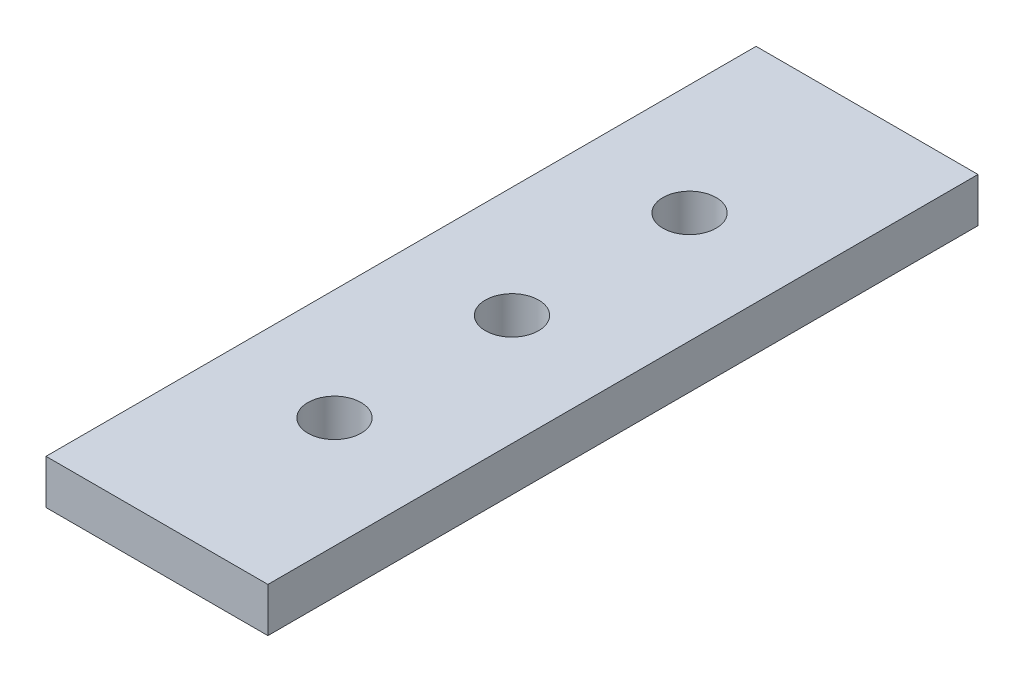
ISO-10303-21;
HEADER;
FILE_DESCRIPTION(('STEP AP214'),'2;1');
FILE_NAME('part.step','',(''),(''),'','','');
FILE_SCHEMA(('AUTOMOTIVE_DESIGN { 1 0 10303 214 1 1 1 1 }'));
ENDSEC;
DATA;
#1=APPLICATION_CONTEXT('core data for automotive mechanical design processes');
#2=APPLICATION_PROTOCOL_DEFINITION('international standard','automotive_design',2000,#1);
#3=PRODUCT_CONTEXT('',#1,'mechanical');
#4=PRODUCT('Part','Part','',(#3));
#5=PRODUCT_RELATED_PRODUCT_CATEGORY('part','',(#4));
#6=PRODUCT_DEFINITION_FORMATION('','',#4);
#7=PRODUCT_DEFINITION_CONTEXT('part definition',#1,'design');
#8=PRODUCT_DEFINITION('design','',#6,#7);
#9=PRODUCT_DEFINITION_SHAPE('','',#8);
#10=(LENGTH_UNIT() NAMED_UNIT(*) SI_UNIT(.MILLI.,.METRE.));
#11=(NAMED_UNIT(*) PLANE_ANGLE_UNIT() SI_UNIT($,.RADIAN.));
#12=(NAMED_UNIT(*) SI_UNIT($,.STERADIAN.) SOLID_ANGLE_UNIT());
#13=UNCERTAINTY_MEASURE_WITH_UNIT(LENGTH_MEASURE(1.E-05),#10,'distance_accuracy_value','');
#14=(GEOMETRIC_REPRESENTATION_CONTEXT(3) GLOBAL_UNCERTAINTY_ASSIGNED_CONTEXT((#13)) GLOBAL_UNIT_ASSIGNED_CONTEXT((#10,
#11,#12)) REPRESENTATION_CONTEXT('',''));
#15=CARTESIAN_POINT('',(0.,0.,0.));
#16=DIRECTION('',(0.,0.,1.));
#17=DIRECTION('',(1.,0.,0.));
#18=AXIS2_PLACEMENT_3D('',#15,#16,#17);
#19=CARTESIAN_POINT('',(0.,10.,0.));
#20=DIRECTION('',(0.,1.,0.));
#21=DIRECTION('',(0.,0.,1.));
#22=AXIS2_PLACEMENT_3D('',#19,#20,#21);
#23=PLANE('',#22);
#24=CARTESIAN_POINT('',(-25.,10.,-80.));
#25=DIRECTION('',(0.,1.,0.));
#26=DIRECTION('',(0.,0.,1.));
#27=AXIS2_PLACEMENT_3D('',#24,#25,#26);
#28=CIRCLE('',#27,6.);
#29=CARTESIAN_POINT('',(-25.,10.,-74.));
#30=VERTEX_POINT('',#29);
#31=EDGE_CURVE('E119',#30,#30,#28,.T.);
#32=ORIENTED_EDGE('',*,*,#31,.F.);
#33=EDGE_LOOP('',(#32));
#34=FACE_BOUND('',#33,.T.);
#35=DIRECTION('',(0.,0.,-1.));
#36=VECTOR('',#35,1.);
#37=CARTESIAN_POINT('',(0.,10.,0.));
#38=LINE('',#37,#36);
#39=CARTESIAN_POINT('',(0.,10.,0.));
#40=VERTEX_POINT('',#39);
#41=CARTESIAN_POINT('',(0.,10.,-160.));
#42=VERTEX_POINT('',#41);
#43=EDGE_CURVE('E89',#40,#42,#38,.T.);
#44=ORIENTED_EDGE('',*,*,#43,.T.);
#45=DIRECTION('',(-1.,0.,0.));
#46=VECTOR('',#45,1.);
#47=CARTESIAN_POINT('',(0.,10.,-160.));
#48=LINE('',#47,#46);
#49=CARTESIAN_POINT('',(-50.,10.,-160.));
#50=VERTEX_POINT('',#49);
#51=EDGE_CURVE('E84',#42,#50,#48,.T.);
#52=ORIENTED_EDGE('',*,*,#51,.T.);
#53=DIRECTION('',(0.,0.,1.));
#54=VECTOR('',#53,1.);
#55=CARTESIAN_POINT('',(-50.,10.,0.));
#56=LINE('',#55,#54);
#57=CARTESIAN_POINT('',(-50.,10.,0.));
#58=VERTEX_POINT('',#57);
#59=EDGE_CURVE('E87',#50,#58,#56,.T.);
#60=ORIENTED_EDGE('',*,*,#59,.T.);
#61=DIRECTION('',(1.,0.,0.));
#62=VECTOR('',#61,1.);
#63=CARTESIAN_POINT('',(0.,10.,0.));
#64=LINE('',#63,#62);
#65=EDGE_CURVE('E54',#58,#40,#64,.T.);
#66=ORIENTED_EDGE('',*,*,#65,.T.);
#67=EDGE_LOOP('',(#44,#52,#60,#66));
#68=FACE_BOUND('',#67,.T.);
#69=CARTESIAN_POINT('',(-25.,10.,-120.));
#70=DIRECTION('',(0.,1.,0.));
#71=DIRECTION('',(0.,0.,1.));
#72=AXIS2_PLACEMENT_3D('',#69,#70,#71);
#73=CIRCLE('',#72,6.);
#74=CARTESIAN_POINT('',(-25.,10.,-114.));
#75=VERTEX_POINT('',#74);
#76=EDGE_CURVE('E104',#75,#75,#73,.T.);
#77=ORIENTED_EDGE('',*,*,#76,.F.);
#78=EDGE_LOOP('',(#77));
#79=FACE_BOUND('',#78,.T.);
#80=CARTESIAN_POINT('',(-25.,10.,-40.));
#81=DIRECTION('',(0.,1.,0.));
#82=DIRECTION('',(0.,0.,1.));
#83=AXIS2_PLACEMENT_3D('',#80,#81,#82);
#84=CIRCLE('',#83,6.);
#85=CARTESIAN_POINT('',(-25.,10.,-34.));
#86=VERTEX_POINT('',#85);
#87=EDGE_CURVE('E125',#86,#86,#84,.T.);
#88=ORIENTED_EDGE('',*,*,#87,.F.);
#89=EDGE_LOOP('',(#88));
#90=FACE_BOUND('',#89,.T.);
#91=ADVANCED_FACE('F37',(#34,#68,#79,#90),#23,.T.);
#92=CARTESIAN_POINT('',(0.,0.,0.));
#93=DIRECTION('',(0.,1.,0.));
#94=DIRECTION('',(0.,0.,1.));
#95=AXIS2_PLACEMENT_3D('',#92,#93,#94);
#96=PLANE('',#95);
#97=DIRECTION('',(0.,0.,-1.));
#98=VECTOR('',#97,1.);
#99=CARTESIAN_POINT('',(0.,0.,0.));
#100=LINE('',#99,#98);
#101=CARTESIAN_POINT('',(0.,0.,0.));
#102=VERTEX_POINT('',#101);
#103=CARTESIAN_POINT('',(0.,0.,-160.));
#104=VERTEX_POINT('',#103);
#105=EDGE_CURVE('E101',#102,#104,#100,.T.);
#106=ORIENTED_EDGE('',*,*,#105,.F.);
#107=DIRECTION('',(1.,0.,0.));
#108=VECTOR('',#107,1.);
#109=CARTESIAN_POINT('',(0.,0.,0.));
#110=LINE('',#109,#108);
#111=CARTESIAN_POINT('',(-50.,0.,0.));
#112=VERTEX_POINT('',#111);
#113=EDGE_CURVE('E77',#112,#102,#110,.T.);
#114=ORIENTED_EDGE('',*,*,#113,.F.);
#115=DIRECTION('',(0.,0.,1.));
#116=VECTOR('',#115,1.);
#117=CARTESIAN_POINT('',(-50.,0.,0.));
#118=LINE('',#117,#116);
#119=CARTESIAN_POINT('',(-50.,0.,-160.));
#120=VERTEX_POINT('',#119);
#121=EDGE_CURVE('E71',#120,#112,#118,.T.);
#122=ORIENTED_EDGE('',*,*,#121,.F.);
#123=DIRECTION('',(-1.,0.,0.));
#124=VECTOR('',#123,1.);
#125=CARTESIAN_POINT('',(0.,0.,-160.));
#126=LINE('',#125,#124);
#127=EDGE_CURVE('E93',#104,#120,#126,.T.);
#128=ORIENTED_EDGE('',*,*,#127,.F.);
#129=EDGE_LOOP('',(#106,#114,#122,#128));
#130=FACE_BOUND('',#129,.T.);
#131=CARTESIAN_POINT('',(-25.,0.,-120.));
#132=DIRECTION('',(0.,1.,0.));
#133=DIRECTION('',(0.,0.,1.));
#134=AXIS2_PLACEMENT_3D('',#131,#132,#133);
#135=CIRCLE('',#134,6.);
#136=CARTESIAN_POINT('',(-25.,0.,-114.));
#137=VERTEX_POINT('',#136);
#138=EDGE_CURVE('E116',#137,#137,#135,.T.);
#139=ORIENTED_EDGE('',*,*,#138,.T.);
#140=EDGE_LOOP('',(#139));
#141=FACE_BOUND('',#140,.T.);
#142=CARTESIAN_POINT('',(-25.,0.,-80.));
#143=DIRECTION('',(0.,1.,0.));
#144=DIRECTION('',(0.,0.,1.));
#145=AXIS2_PLACEMENT_3D('',#142,#143,#144);
#146=CIRCLE('',#145,6.);
#147=CARTESIAN_POINT('',(-25.,0.,-74.));
#148=VERTEX_POINT('',#147);
#149=EDGE_CURVE('E122',#148,#148,#146,.T.);
#150=ORIENTED_EDGE('',*,*,#149,.T.);
#151=EDGE_LOOP('',(#150));
#152=FACE_BOUND('',#151,.T.);
#153=CARTESIAN_POINT('',(-25.,0.,-40.));
#154=DIRECTION('',(0.,1.,0.));
#155=DIRECTION('',(0.,0.,1.));
#156=AXIS2_PLACEMENT_3D('',#153,#154,#155);
#157=CIRCLE('',#156,6.);
#158=CARTESIAN_POINT('',(-25.,0.,-34.));
#159=VERTEX_POINT('',#158);
#160=EDGE_CURVE('E128',#159,#159,#157,.T.);
#161=ORIENTED_EDGE('',*,*,#160,.T.);
#162=EDGE_LOOP('',(#161));
#163=FACE_BOUND('',#162,.T.);
#164=ADVANCED_FACE('F112',(#130,#141,#152,#163),#96,.F.);
#165=CARTESIAN_POINT('',(0.,10.,0.));
#166=DIRECTION('',(-1.,0.,0.));
#167=DIRECTION('',(0.,0.,1.));
#168=AXIS2_PLACEMENT_3D('',#165,#166,#167);
#169=PLANE('',#168);
#170=ORIENTED_EDGE('',*,*,#105,.T.);
#171=DIRECTION('',(0.,-1.,0.));
#172=VECTOR('',#171,1.);
#173=CARTESIAN_POINT('',(0.,10.,-160.));
#174=LINE('',#173,#172);
#175=EDGE_CURVE('E11',#42,#104,#174,.T.);
#176=ORIENTED_EDGE('',*,*,#175,.F.);
#177=ORIENTED_EDGE('',*,*,#43,.F.);
#178=DIRECTION('',(0.,-1.,0.));
#179=VECTOR('',#178,1.);
#180=CARTESIAN_POINT('',(0.,10.,0.));
#181=LINE('',#180,#179);
#182=EDGE_CURVE('E97',#40,#102,#181,.T.);
#183=ORIENTED_EDGE('',*,*,#182,.T.);
#184=EDGE_LOOP('',(#170,#176,#177,#183));
#185=FACE_BOUND('',#184,.T.);
#186=ADVANCED_FACE('F39',(#185),#169,.F.);
#187=CARTESIAN_POINT('',(0.,10.,-160.));
#188=DIRECTION('',(0.,0.,1.));
#189=DIRECTION('',(1.,0.,0.));
#190=AXIS2_PLACEMENT_3D('',#187,#188,#189);
#191=PLANE('',#190);
#192=ORIENTED_EDGE('',*,*,#127,.T.);
#193=DIRECTION('',(0.,-1.,0.));
#194=VECTOR('',#193,1.);
#195=CARTESIAN_POINT('',(-50.,10.,-160.));
#196=LINE('',#195,#194);
#197=EDGE_CURVE('E46',#50,#120,#196,.T.);
#198=ORIENTED_EDGE('',*,*,#197,.F.);
#199=ORIENTED_EDGE('',*,*,#51,.F.);
#200=ORIENTED_EDGE('',*,*,#175,.T.);
#201=EDGE_LOOP('',(#192,#198,#199,#200));
#202=FACE_BOUND('',#201,.T.);
#203=ADVANCED_FACE('F92',(#202),#191,.F.);
#204=CARTESIAN_POINT('',(-50.,10.,0.));
#205=DIRECTION('',(1.,0.,0.));
#206=DIRECTION('',(0.,0.,-1.));
#207=AXIS2_PLACEMENT_3D('',#204,#205,#206);
#208=PLANE('',#207);
#209=ORIENTED_EDGE('',*,*,#121,.T.);
#210=DIRECTION('',(0.,-1.,0.));
#211=VECTOR('',#210,1.);
#212=CARTESIAN_POINT('',(-50.,10.,0.));
#213=LINE('',#212,#211);
#214=EDGE_CURVE('E94',#58,#112,#213,.T.);
#215=ORIENTED_EDGE('',*,*,#214,.F.);
#216=ORIENTED_EDGE('',*,*,#59,.F.);
#217=ORIENTED_EDGE('',*,*,#197,.T.);
#218=EDGE_LOOP('',(#209,#215,#216,#217));
#219=FACE_BOUND('',#218,.T.);
#220=ADVANCED_FACE('F95',(#219),#208,.F.);
#221=CARTESIAN_POINT('',(0.,10.,0.));
#222=DIRECTION('',(0.,0.,-1.));
#223=DIRECTION('',(-1.,0.,0.));
#224=AXIS2_PLACEMENT_3D('',#221,#222,#223);
#225=PLANE('',#224);
#226=ORIENTED_EDGE('',*,*,#113,.T.);
#227=ORIENTED_EDGE('',*,*,#182,.F.);
#228=ORIENTED_EDGE('',*,*,#65,.F.);
#229=ORIENTED_EDGE('',*,*,#214,.T.);
#230=EDGE_LOOP('',(#226,#227,#228,#229));
#231=FACE_BOUND('',#230,.T.);
#232=ADVANCED_FACE('F109',(#231),#225,.F.);
#233=CARTESIAN_POINT('',(-25.,10.,-120.));
#234=DIRECTION('',(0.,-1.,0.));
#235=DIRECTION('',(0.,0.,-1.));
#236=AXIS2_PLACEMENT_3D('',#233,#234,#235);
#237=CYLINDRICAL_SURFACE('',#236,6.);
#238=ORIENTED_EDGE('',*,*,#76,.T.);
#239=EDGE_LOOP('',(#238));
#240=FACE_BOUND('',#239,.T.);
#241=ORIENTED_EDGE('',*,*,#138,.F.);
#242=EDGE_LOOP('',(#241));
#243=FACE_BOUND('',#242,.T.);
#244=ADVANCED_FACE('F146',(#240,#243),#237,.F.);
#245=CARTESIAN_POINT('',(-25.,10.,-80.));
#246=DIRECTION('',(0.,-1.,0.));
#247=DIRECTION('',(0.,0.,-1.));
#248=AXIS2_PLACEMENT_3D('',#245,#246,#247);
#249=CYLINDRICAL_SURFACE('',#248,6.);
#250=ORIENTED_EDGE('',*,*,#31,.T.);
#251=EDGE_LOOP('',(#250));
#252=FACE_BOUND('',#251,.T.);
#253=ORIENTED_EDGE('',*,*,#149,.F.);
#254=EDGE_LOOP('',(#253));
#255=FACE_BOUND('',#254,.T.);
#256=ADVANCED_FACE('F192',(#252,#255),#249,.F.);
#257=CARTESIAN_POINT('',(-25.,10.,-40.));
#258=DIRECTION('',(0.,-1.,0.));
#259=DIRECTION('',(0.,0.,-1.));
#260=AXIS2_PLACEMENT_3D('',#257,#258,#259);
#261=CYLINDRICAL_SURFACE('',#260,6.);
#262=ORIENTED_EDGE('',*,*,#87,.T.);
#263=EDGE_LOOP('',(#262));
#264=FACE_BOUND('',#263,.T.);
#265=ORIENTED_EDGE('',*,*,#160,.F.);
#266=EDGE_LOOP('',(#265));
#267=FACE_BOUND('',#266,.T.);
#268=ADVANCED_FACE('F134',(#264,#267),#261,.F.);
#269=CLOSED_SHELL('',(#91,#164,#186,#203,#220,#232,#244,#256,#268));
#270=MANIFOLD_SOLID_BREP('B2',#269);
#271=ADVANCED_BREP_SHAPE_REPRESENTATION('',(#18,#270),#14);
#272=SHAPE_DEFINITION_REPRESENTATION(#9,#271);
ENDSEC;
END-ISO-10303-21;
